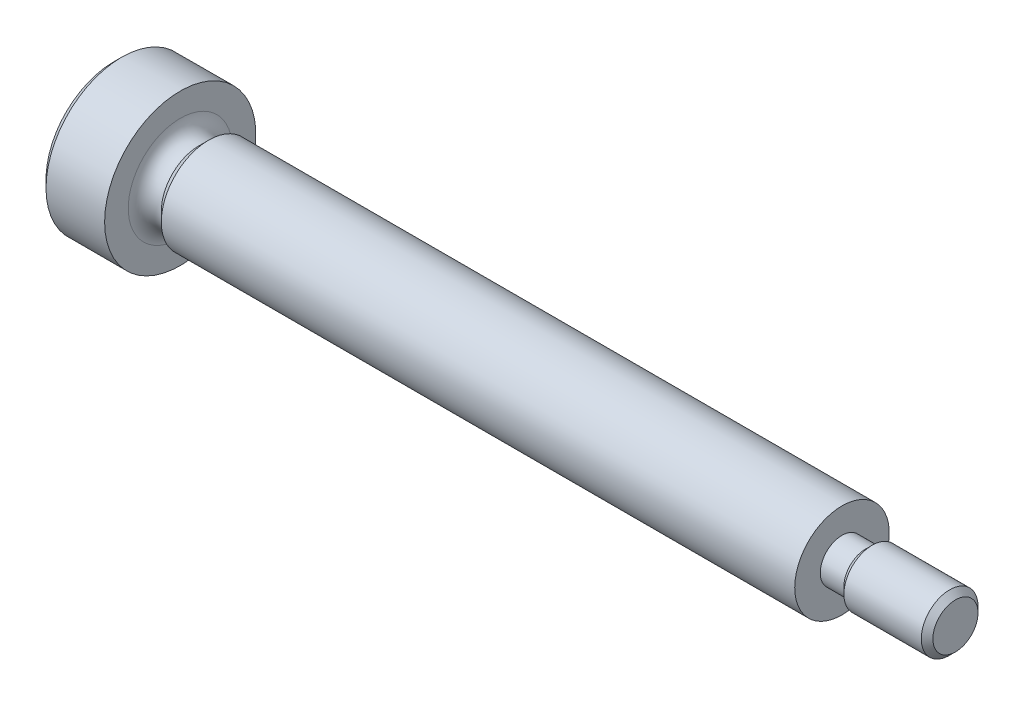
ISO-10303-21;
HEADER;
FILE_DESCRIPTION(('STEP AP214'),'2;1');
FILE_NAME('part.step','',(''),(''),'','','');
FILE_SCHEMA(('AUTOMOTIVE_DESIGN { 1 0 10303 214 1 1 1 1 }'));
ENDSEC;
DATA;
#1=APPLICATION_CONTEXT('core data for automotive mechanical design processes');
#2=APPLICATION_PROTOCOL_DEFINITION('international standard','automotive_design',2000,#1);
#3=PRODUCT_CONTEXT('',#1,'mechanical');
#4=PRODUCT('Part','Part','',(#3));
#5=PRODUCT_RELATED_PRODUCT_CATEGORY('part','',(#4));
#6=PRODUCT_DEFINITION_FORMATION('','',#4);
#7=PRODUCT_DEFINITION_CONTEXT('part definition',#1,'design');
#8=PRODUCT_DEFINITION('design','',#6,#7);
#9=PRODUCT_DEFINITION_SHAPE('','',#8);
#10=(LENGTH_UNIT() NAMED_UNIT(*) SI_UNIT(.MILLI.,.METRE.));
#11=(NAMED_UNIT(*) PLANE_ANGLE_UNIT() SI_UNIT($,.RADIAN.));
#12=(NAMED_UNIT(*) SI_UNIT($,.STERADIAN.) SOLID_ANGLE_UNIT());
#13=UNCERTAINTY_MEASURE_WITH_UNIT(LENGTH_MEASURE(1.E-05),#10,'distance_accuracy_value','');
#14=(GEOMETRIC_REPRESENTATION_CONTEXT(3) GLOBAL_UNCERTAINTY_ASSIGNED_CONTEXT((#13)) GLOBAL_UNIT_ASSIGNED_CONTEXT((#10,
#11,#12)) REPRESENTATION_CONTEXT('',''));
#15=CARTESIAN_POINT('',(0.,0.,0.));
#16=DIRECTION('',(0.,0.,1.));
#17=DIRECTION('',(1.,0.,0.));
#18=AXIS2_PLACEMENT_3D('',#15,#16,#17);
#19=CARTESIAN_POINT('',(-3.5,-3.60000000000003,3.60000027634451));
#20=DIRECTION('',(-1.,0.,0.));
#21=DIRECTION('',(0.,1.,0.));
#22=AXIS2_PLACEMENT_3D('',#19,#20,#21);
#23=PLANE('',#22);
#24=CARTESIAN_POINT('',(-3.5,0.,0.));
#25=DIRECTION('',(-1.,0.,0.));
#26=DIRECTION('',(0.,0.,-1.));
#27=AXIS2_PLACEMENT_3D('',#24,#25,#26);
#28=CIRCLE('',#27,3.6);
#29=CARTESIAN_POINT('',(-3.5,0.,-3.6));
#30=VERTEX_POINT('',#29);
#31=EDGE_CURVE('E111',#30,#30,#28,.F.);
#32=ORIENTED_EDGE('',*,*,#31,.F.);
#33=EDGE_LOOP('',(#32));
#34=FACE_BOUND('',#33,.T.);
#35=DIRECTION('',(0.,0.500000000000019,-0.866025403784427));
#36=VECTOR('',#35,1.);
#37=CARTESIAN_POINT('',(-3.5,-1.4433756729741,0.));
#38=LINE('',#37,#36);
#39=CARTESIAN_POINT('',(-3.5,-0.721687836487031,-1.25));
#40=VERTEX_POINT('',#39);
#41=CARTESIAN_POINT('',(-3.5,-1.4433756729741,0.));
#42=VERTEX_POINT('',#41);
#43=EDGE_CURVE('E98',#40,#42,#38,.F.);
#44=ORIENTED_EDGE('',*,*,#43,.F.);
#45=DIRECTION('',(0.,1.,0.));
#46=VECTOR('',#45,1.);
#47=CARTESIAN_POINT('',(-3.5,-0.72168783648703,-1.25));
#48=LINE('',#47,#46);
#49=CARTESIAN_POINT('',(-3.5,0.721687836487031,-1.25));
#50=VERTEX_POINT('',#49);
#51=EDGE_CURVE('E87',#50,#40,#48,.F.);
#52=ORIENTED_EDGE('',*,*,#51,.F.);
#53=DIRECTION('',(0.,0.500000000000019,0.866025403784427));
#54=VECTOR('',#53,1.);
#55=CARTESIAN_POINT('',(-3.5,0.721687836487028,-1.25));
#56=LINE('',#55,#54);
#57=CARTESIAN_POINT('',(-3.5,1.4433756729741,0.));
#58=VERTEX_POINT('',#57);
#59=EDGE_CURVE('E97',#58,#50,#56,.F.);
#60=ORIENTED_EDGE('',*,*,#59,.F.);
#61=DIRECTION('',(0.,-0.50000000000002,0.866025403784427));
#62=VECTOR('',#61,1.);
#63=CARTESIAN_POINT('',(-3.5,1.4433756729741,0.));
#64=LINE('',#63,#62);
#65=CARTESIAN_POINT('',(-3.5,0.721687836487028,1.25));
#66=VERTEX_POINT('',#65);
#67=EDGE_CURVE('E121',#66,#58,#64,.F.);
#68=ORIENTED_EDGE('',*,*,#67,.F.);
#69=DIRECTION('',(0.,-1.,0.));
#70=VECTOR('',#69,1.);
#71=CARTESIAN_POINT('',(-3.5,0.721687836487031,1.25));
#72=LINE('',#71,#70);
#73=CARTESIAN_POINT('',(-3.5,-0.72168783648703,1.25));
#74=VERTEX_POINT('',#73);
#75=EDGE_CURVE('E125',#74,#66,#72,.F.);
#76=ORIENTED_EDGE('',*,*,#75,.F.);
#77=DIRECTION('',(0.,-0.50000000000002,-0.866025403784427));
#78=VECTOR('',#77,1.);
#79=CARTESIAN_POINT('',(-3.5,-0.721687836487031,1.25));
#80=LINE('',#79,#78);
#81=EDGE_CURVE('E110',#42,#74,#80,.F.);
#82=ORIENTED_EDGE('',*,*,#81,.F.);
#83=EDGE_LOOP('',(#44,#52,#60,#68,#76,#82));
#84=FACE_BOUND('',#83,.T.);
#85=ADVANCED_FACE('F17',(#34,#84),#23,.T.);
#86=CARTESIAN_POINT('',(0.,-4.,-4.));
#87=DIRECTION('',(1.,0.,0.));
#88=DIRECTION('',(0.,1.,0.));
#89=AXIS2_PLACEMENT_3D('',#86,#87,#88);
#90=PLANE('',#89);
#91=CARTESIAN_POINT('',(0.,0.,0.));
#92=DIRECTION('',(1.,0.,0.));
#93=DIRECTION('',(0.,0.,1.));
#94=AXIS2_PLACEMENT_3D('',#91,#92,#93);
#95=CIRCLE('',#94,4.);
#96=CARTESIAN_POINT('',(0.,0.,4.));
#97=VERTEX_POINT('',#96);
#98=EDGE_CURVE('E133',#97,#97,#95,.T.);
#99=ORIENTED_EDGE('',*,*,#98,.T.);
#100=EDGE_LOOP('',(#99));
#101=FACE_BOUND('',#100,.T.);
#102=CARTESIAN_POINT('',(0.,0.,0.));
#103=DIRECTION('',(-1.,0.,0.));
#104=DIRECTION('',(0.,0.,-1.));
#105=AXIS2_PLACEMENT_3D('',#102,#103,#104);
#106=CIRCLE('',#105,2.75);
#107=CARTESIAN_POINT('',(0.,0.,-2.75));
#108=VERTEX_POINT('',#107);
#109=EDGE_CURVE('E138',#108,#108,#106,.F.);
#110=ORIENTED_EDGE('',*,*,#109,.F.);
#111=EDGE_LOOP('',(#110));
#112=FACE_BOUND('',#111,.T.);
#113=ADVANCED_FACE('F284',(#101,#112),#90,.T.);
#114=CARTESIAN_POINT('',(35.,-2.49999987914998,-2.5));
#115=DIRECTION('',(1.,0.,0.));
#116=DIRECTION('',(0.,1.,0.));
#117=AXIS2_PLACEMENT_3D('',#114,#115,#116);
#118=PLANE('',#117);
#119=CARTESIAN_POINT('',(35.,0.,0.));
#120=DIRECTION('',(1.,0.,0.));
#121=DIRECTION('',(0.,-1.41721898572201E-07,0.99999999999999));
#122=AXIS2_PLACEMENT_3D('',#119,#120,#121);
#123=CIRCLE('',#122,2.5);
#124=CARTESIAN_POINT('',(35.,-3.54304746430502E-07,2.49999999999997));
#125=VERTEX_POINT('',#124);
#126=EDGE_CURVE('E141',#125,#125,#123,.T.);
#127=ORIENTED_EDGE('',*,*,#126,.T.);
#128=EDGE_LOOP('',(#127));
#129=FACE_BOUND('',#128,.T.);
#130=CARTESIAN_POINT('',(35.,0.,0.));
#131=DIRECTION('',(-1.,0.,0.));
#132=DIRECTION('',(0.,0.,-1.));
#133=AXIS2_PLACEMENT_3D('',#130,#131,#132);
#134=CIRCLE('',#133,1.15);
#135=CARTESIAN_POINT('',(35.,0.,-1.15));
#136=VERTEX_POINT('',#135);
#137=EDGE_CURVE('E144',#136,#136,#134,.F.);
#138=ORIENTED_EDGE('',*,*,#137,.F.);
#139=EDGE_LOOP('',(#138));
#140=FACE_BOUND('',#139,.T.);
#141=ADVANCED_FACE('F281',(#129,#140),#118,.T.);
#142=CARTESIAN_POINT('',(41.,-1.20903473026753,-1.1935));
#143=DIRECTION('',(1.,0.,0.));
#144=DIRECTION('',(0.,1.,0.));
#145=AXIS2_PLACEMENT_3D('',#142,#143,#144);
#146=PLANE('',#145);
#147=CARTESIAN_POINT('',(41.,0.,0.));
#148=DIRECTION('',(1.,0.,0.));
#149=DIRECTION('',(0.,0.,1.));
#150=AXIS2_PLACEMENT_3D('',#147,#148,#149);
#151=CIRCLE('',#150,1.1935);
#152=CARTESIAN_POINT('',(41.,0.,1.1935));
#153=VERTEX_POINT('',#152);
#154=EDGE_CURVE('E147',#153,#153,#151,.T.);
#155=ORIENTED_EDGE('',*,*,#154,.T.);
#156=EDGE_LOOP('',(#155));
#157=FACE_BOUND('',#156,.T.);
#158=ADVANCED_FACE('F283',(#157),#146,.T.);
#159=CARTESIAN_POINT('',(-1.9,-1.08253175473054,-0.625000000000031));
#160=DIRECTION('',(-1.,0.,0.));
#161=DIRECTION('',(0.,1.,0.));
#162=AXIS2_PLACEMENT_3D('',#159,#160,#161);
#163=PLANE('',#162);
#164=DIRECTION('',(0.,-1.,0.));
#165=VECTOR('',#164,1.);
#166=CARTESIAN_POINT('',(-1.9,0.,-1.25));
#167=LINE('',#166,#165);
#168=CARTESIAN_POINT('',(-1.9,-0.72168783648703,-1.25));
#169=VERTEX_POINT('',#168);
#170=CARTESIAN_POINT('',(-1.9,0.,-1.25));
#171=VERTEX_POINT('',#170);
#172=EDGE_CURVE('E150',#169,#171,#167,.F.);
#173=ORIENTED_EDGE('',*,*,#172,.F.);
#174=DIRECTION('',(0.,-0.500000000000018,0.866025403784428));
#175=VECTOR('',#174,1.);
#176=CARTESIAN_POINT('',(-1.9,-0.721687836487029,-1.25));
#177=LINE('',#176,#175);
#178=CARTESIAN_POINT('',(-1.9,-1.08253175473054,-0.625000000000031));
#179=VERTEX_POINT('',#178);
#180=EDGE_CURVE('E105',#179,#169,#177,.F.);
#181=ORIENTED_EDGE('',*,*,#180,.F.);
#182=CARTESIAN_POINT('',(-1.9,0.,0.));
#183=DIRECTION('',(1.,0.,0.));
#184=DIRECTION('',(0.,-0.866025403784427,-0.50000000000002));
#185=AXIS2_PLACEMENT_3D('',#182,#183,#184);
#186=CIRCLE('',#185,1.25);
#187=EDGE_CURVE('E155',#179,#171,#186,.T.);
#188=ORIENTED_EDGE('',*,*,#187,.T.);
#189=EDGE_LOOP('',(#173,#181,#188));
#190=FACE_BOUND('',#189,.T.);
#191=ADVANCED_FACE('F292',(#190),#163,.T.);
#192=CARTESIAN_POINT('',(-1.9,-1.4433756729741,0.625000000000032));
#193=DIRECTION('',(-1.,0.,0.));
#194=DIRECTION('',(0.,1.,0.));
#195=AXIS2_PLACEMENT_3D('',#192,#193,#194);
#196=PLANE('',#195);
#197=DIRECTION('',(0.,-0.500000000000022,0.866025403784426));
#198=VECTOR('',#197,1.);
#199=CARTESIAN_POINT('',(-1.9,-1.08253175473054,-0.625000000000031));
#200=LINE('',#199,#198);
#201=CARTESIAN_POINT('',(-1.9,-1.4433756729741,0.));
#202=VERTEX_POINT('',#201);
#203=EDGE_CURVE('E160',#202,#179,#200,.F.);
#204=ORIENTED_EDGE('',*,*,#203,.F.);
#205=DIRECTION('',(0.,0.500000000000022,0.866025403784426));
#206=VECTOR('',#205,1.);
#207=CARTESIAN_POINT('',(-1.9,-1.4433756729741,0.));
#208=LINE('',#207,#206);
#209=CARTESIAN_POINT('',(-1.9,-1.08253175473054,0.625000000000031));
#210=VERTEX_POINT('',#209);
#211=EDGE_CURVE('E164',#210,#202,#208,.F.);
#212=ORIENTED_EDGE('',*,*,#211,.F.);
#213=CARTESIAN_POINT('',(-1.9,0.,0.));
#214=DIRECTION('',(1.,0.,0.));
#215=DIRECTION('',(0.,-0.866025403784427,0.50000000000002));
#216=AXIS2_PLACEMENT_3D('',#213,#214,#215);
#217=CIRCLE('',#216,1.25);
#218=EDGE_CURVE('E169',#210,#179,#217,.T.);
#219=ORIENTED_EDGE('',*,*,#218,.T.);
#220=EDGE_LOOP('',(#204,#212,#219));
#221=FACE_BOUND('',#220,.T.);
#222=ADVANCED_FACE('F355',(#221),#196,.T.);
#223=CARTESIAN_POINT('',(-1.9,-1.08253175473054,1.25));
#224=DIRECTION('',(-1.,0.,0.));
#225=DIRECTION('',(0.,1.,0.));
#226=AXIS2_PLACEMENT_3D('',#223,#224,#225);
#227=PLANE('',#226);
#228=DIRECTION('',(0.,0.500000000000017,0.866025403784429));
#229=VECTOR('',#228,1.);
#230=CARTESIAN_POINT('',(-1.9,-1.08253175473054,0.625000000000031));
#231=LINE('',#230,#229);
#232=CARTESIAN_POINT('',(-1.9,-0.72168783648703,1.25));
#233=VERTEX_POINT('',#232);
#234=EDGE_CURVE('E174',#233,#210,#231,.F.);
#235=ORIENTED_EDGE('',*,*,#234,.F.);
#236=DIRECTION('',(0.,1.,0.));
#237=VECTOR('',#236,1.);
#238=CARTESIAN_POINT('',(-1.9,-0.72168783648703,1.25));
#239=LINE('',#238,#237);
#240=CARTESIAN_POINT('',(-1.9,0.,1.25));
#241=VERTEX_POINT('',#240);
#242=EDGE_CURVE('E178',#241,#233,#239,.F.);
#243=ORIENTED_EDGE('',*,*,#242,.F.);
#244=CARTESIAN_POINT('',(-1.9,0.,0.));
#245=DIRECTION('',(1.,0.,0.));
#246=DIRECTION('',(0.,0.,1.));
#247=AXIS2_PLACEMENT_3D('',#244,#245,#246);
#248=CIRCLE('',#247,1.25);
#249=EDGE_CURVE('E183',#241,#210,#248,.T.);
#250=ORIENTED_EDGE('',*,*,#249,.T.);
#251=EDGE_LOOP('',(#235,#243,#250));
#252=FACE_BOUND('',#251,.T.);
#253=ADVANCED_FACE('F361',(#252),#227,.T.);
#254=CARTESIAN_POINT('',(-1.9,0.,1.25));
#255=DIRECTION('',(-1.,0.,0.));
#256=DIRECTION('',(0.,1.,0.));
#257=AXIS2_PLACEMENT_3D('',#254,#255,#256);
#258=PLANE('',#257);
#259=DIRECTION('',(0.,1.,0.));
#260=VECTOR('',#259,1.);
#261=CARTESIAN_POINT('',(-1.9,0.,1.25));
#262=LINE('',#261,#260);
#263=CARTESIAN_POINT('',(-1.9,0.72168783648703,1.25));
#264=VERTEX_POINT('',#263);
#265=EDGE_CURVE('E188',#264,#241,#262,.F.);
#266=ORIENTED_EDGE('',*,*,#265,.F.);
#267=DIRECTION('',(0.,0.500000000000018,-0.866025403784428));
#268=VECTOR('',#267,1.);
#269=CARTESIAN_POINT('',(-1.9,0.721687836487029,1.25));
#270=LINE('',#269,#268);
#271=CARTESIAN_POINT('',(-1.9,1.08253175473054,0.625000000000031));
#272=VERTEX_POINT('',#271);
#273=EDGE_CURVE('E192',#272,#264,#270,.F.);
#274=ORIENTED_EDGE('',*,*,#273,.F.);
#275=CARTESIAN_POINT('',(-1.9,0.,0.));
#276=DIRECTION('',(1.,0.,0.));
#277=DIRECTION('',(0.,0.866025403784427,0.50000000000002));
#278=AXIS2_PLACEMENT_3D('',#275,#276,#277);
#279=CIRCLE('',#278,1.25);
#280=EDGE_CURVE('E196',#272,#241,#279,.T.);
#281=ORIENTED_EDGE('',*,*,#280,.T.);
#282=EDGE_LOOP('',(#266,#274,#281));
#283=FACE_BOUND('',#282,.T.);
#284=ADVANCED_FACE('F368',(#283),#258,.T.);
#285=CARTESIAN_POINT('',(-1.9,1.08253175473053,0.625000000000032));
#286=DIRECTION('',(-1.,0.,0.));
#287=DIRECTION('',(0.,1.,0.));
#288=AXIS2_PLACEMENT_3D('',#285,#286,#287);
#289=PLANE('',#288);
#290=DIRECTION('',(0.,0.500000000000023,-0.866025403784426));
#291=VECTOR('',#290,1.);
#292=CARTESIAN_POINT('',(-1.9,1.08253175473054,0.625000000000031));
#293=LINE('',#292,#291);
#294=CARTESIAN_POINT('',(-1.9,1.4433756729741,0.));
#295=VERTEX_POINT('',#294);
#296=EDGE_CURVE('E201',#295,#272,#293,.F.);
#297=ORIENTED_EDGE('',*,*,#296,.F.);
#298=DIRECTION('',(0.,-0.500000000000022,-0.866025403784426));
#299=VECTOR('',#298,1.);
#300=CARTESIAN_POINT('',(-1.9,1.4433756729741,0.));
#301=LINE('',#300,#299);
#302=CARTESIAN_POINT('',(-1.9,1.08253175473054,-0.625000000000031));
#303=VERTEX_POINT('',#302);
#304=EDGE_CURVE('E205',#303,#295,#301,.F.);
#305=ORIENTED_EDGE('',*,*,#304,.F.);
#306=CARTESIAN_POINT('',(-1.9,0.,0.));
#307=DIRECTION('',(1.,0.,0.));
#308=DIRECTION('',(0.,0.866025403784427,-0.50000000000002));
#309=AXIS2_PLACEMENT_3D('',#306,#307,#308);
#310=CIRCLE('',#309,1.25);
#311=EDGE_CURVE('E210',#303,#272,#310,.T.);
#312=ORIENTED_EDGE('',*,*,#311,.T.);
#313=EDGE_LOOP('',(#297,#305,#312));
#314=FACE_BOUND('',#313,.T.);
#315=ADVANCED_FACE('F373',(#314),#289,.T.);
#316=CARTESIAN_POINT('',(-1.9,0.,-0.625000000000031));
#317=DIRECTION('',(-1.,0.,0.));
#318=DIRECTION('',(0.,1.,0.));
#319=AXIS2_PLACEMENT_3D('',#316,#317,#318);
#320=PLANE('',#319);
#321=DIRECTION('',(0.,-0.500000000000017,-0.866025403784429));
#322=VECTOR('',#321,1.);
#323=CARTESIAN_POINT('',(-1.9,1.08253175473054,-0.625000000000031));
#324=LINE('',#323,#322);
#325=CARTESIAN_POINT('',(-1.9,0.72168783648703,-1.25));
#326=VERTEX_POINT('',#325);
#327=EDGE_CURVE('E215',#326,#303,#324,.F.);
#328=ORIENTED_EDGE('',*,*,#327,.F.);
#329=DIRECTION('',(0.,-1.,0.));
#330=VECTOR('',#329,1.);
#331=CARTESIAN_POINT('',(-1.9,0.72168783648703,-1.25));
#332=LINE('',#331,#330);
#333=EDGE_CURVE('E219',#171,#326,#332,.F.);
#334=ORIENTED_EDGE('',*,*,#333,.F.);
#335=CARTESIAN_POINT('',(-1.9,0.,0.));
#336=DIRECTION('',(1.,0.,0.));
#337=DIRECTION('',(0.,0.,-1.));
#338=AXIS2_PLACEMENT_3D('',#335,#336,#337);
#339=CIRCLE('',#338,1.25);
#340=EDGE_CURVE('E223',#171,#303,#339,.T.);
#341=ORIENTED_EDGE('',*,*,#340,.T.);
#342=EDGE_LOOP('',(#328,#334,#341));
#343=FACE_BOUND('',#342,.T.);
#344=ADVANCED_FACE('F376',(#343),#320,.T.);
#345=CARTESIAN_POINT('',(-1.9,-0.72168783648703,1.25));
#346=DIRECTION('',(0.,0.,-1.));
#347=DIRECTION('',(-1.,0.,0.));
#348=AXIS2_PLACEMENT_3D('',#345,#346,#347);
#349=PLANE('',#348);
#350=ORIENTED_EDGE('',*,*,#265,.T.);
#351=ORIENTED_EDGE('',*,*,#242,.T.);
#352=DIRECTION('',(-1.,0.,0.));
#353=VECTOR('',#352,1.);
#354=CARTESIAN_POINT('',(-1.9,-0.72168783648703,1.25));
#355=LINE('',#354,#353);
#356=EDGE_CURVE('E228',#233,#74,#355,.T.);
#357=ORIENTED_EDGE('',*,*,#356,.T.);
#358=ORIENTED_EDGE('',*,*,#75,.T.);
#359=DIRECTION('',(1.,0.,0.));
#360=VECTOR('',#359,1.);
#361=CARTESIAN_POINT('',(-3.5,0.72168783648703,1.25));
#362=LINE('',#361,#360);
#363=EDGE_CURVE('E233',#264,#66,#362,.F.);
#364=ORIENTED_EDGE('',*,*,#363,.F.);
#365=EDGE_LOOP('',(#350,#351,#357,#358,#364));
#366=FACE_BOUND('',#365,.T.);
#367=ADVANCED_FACE('F363',(#366),#349,.T.);
#368=CARTESIAN_POINT('',(-3.5,-1.4433756729741,0.));
#369=DIRECTION('',(0.,0.866025403784427,-0.50000000000002));
#370=DIRECTION('',(0.,0.50000000000002,0.866025403784427));
#371=AXIS2_PLACEMENT_3D('',#368,#369,#370);
#372=PLANE('',#371);
#373=ORIENTED_EDGE('',*,*,#234,.T.);
#374=ORIENTED_EDGE('',*,*,#211,.T.);
#375=DIRECTION('',(-1.,0.,0.));
#376=VECTOR('',#375,1.);
#377=CARTESIAN_POINT('',(-1.9,-1.4433756729741,0.));
#378=LINE('',#377,#376);
#379=EDGE_CURVE('E106',#202,#42,#378,.T.);
#380=ORIENTED_EDGE('',*,*,#379,.T.);
#381=ORIENTED_EDGE('',*,*,#81,.T.);
#382=ORIENTED_EDGE('',*,*,#356,.F.);
#383=EDGE_LOOP('',(#373,#374,#380,#381,#382));
#384=FACE_BOUND('',#383,.T.);
#385=ADVANCED_FACE('F357',(#384),#372,.T.);
#386=CARTESIAN_POINT('',(-3.5,-0.72168783648703,-1.25));
#387=DIRECTION('',(0.,0.866025403784427,0.50000000000002));
#388=DIRECTION('',(0.,-0.50000000000002,0.866025403784427));
#389=AXIS2_PLACEMENT_3D('',#386,#387,#388);
#390=PLANE('',#389);
#391=ORIENTED_EDGE('',*,*,#203,.T.);
#392=ORIENTED_EDGE('',*,*,#180,.T.);
#393=DIRECTION('',(-1.,0.,0.));
#394=VECTOR('',#393,1.);
#395=CARTESIAN_POINT('',(-1.9,-0.72168783648703,-1.25));
#396=LINE('',#395,#394);
#397=EDGE_CURVE('E91',#169,#40,#396,.T.);
#398=ORIENTED_EDGE('',*,*,#397,.T.);
#399=ORIENTED_EDGE('',*,*,#43,.T.);
#400=ORIENTED_EDGE('',*,*,#379,.F.);
#401=EDGE_LOOP('',(#391,#392,#398,#399,#400));
#402=FACE_BOUND('',#401,.T.);
#403=ADVANCED_FACE('F102',(#402),#390,.T.);
#404=CARTESIAN_POINT('',(-3.5,-0.72168783648703,-1.25));
#405=DIRECTION('',(0.,0.,1.));
#406=DIRECTION('',(1.,0.,0.));
#407=AXIS2_PLACEMENT_3D('',#404,#405,#406);
#408=PLANE('',#407);
#409=ORIENTED_EDGE('',*,*,#172,.T.);
#410=ORIENTED_EDGE('',*,*,#333,.T.);
#411=DIRECTION('',(-1.,0.,0.));
#412=VECTOR('',#411,1.);
#413=CARTESIAN_POINT('',(-1.9,0.72168783648703,-1.25));
#414=LINE('',#413,#412);
#415=EDGE_CURVE('E35',#326,#50,#414,.T.);
#416=ORIENTED_EDGE('',*,*,#415,.T.);
#417=ORIENTED_EDGE('',*,*,#51,.T.);
#418=ORIENTED_EDGE('',*,*,#397,.F.);
#419=EDGE_LOOP('',(#409,#410,#416,#417,#418));
#420=FACE_BOUND('',#419,.T.);
#421=ADVANCED_FACE('F90',(#420),#408,.T.);
#422=CARTESIAN_POINT('',(-3.5,1.4433756729741,0.));
#423=DIRECTION('',(0.,-0.866025403784427,0.50000000000002));
#424=DIRECTION('',(0.,-0.50000000000002,-0.866025403784427));
#425=AXIS2_PLACEMENT_3D('',#422,#423,#424);
#426=PLANE('',#425);
#427=ORIENTED_EDGE('',*,*,#327,.T.);
#428=ORIENTED_EDGE('',*,*,#304,.T.);
#429=DIRECTION('',(-1.,0.,0.));
#430=VECTOR('',#429,1.);
#431=CARTESIAN_POINT('',(-1.9,1.4433756729741,0.));
#432=LINE('',#431,#430);
#433=EDGE_CURVE('E245',#295,#58,#432,.T.);
#434=ORIENTED_EDGE('',*,*,#433,.T.);
#435=ORIENTED_EDGE('',*,*,#59,.T.);
#436=ORIENTED_EDGE('',*,*,#415,.F.);
#437=EDGE_LOOP('',(#427,#428,#434,#435,#436));
#438=FACE_BOUND('',#437,.T.);
#439=ADVANCED_FACE('F317',(#438),#426,.T.);
#440=CARTESIAN_POINT('',(-3.5,0.72168783648703,1.25));
#441=DIRECTION('',(0.,-0.866025403784427,-0.50000000000002));
#442=DIRECTION('',(0.,0.50000000000002,-0.866025403784427));
#443=AXIS2_PLACEMENT_3D('',#440,#441,#442);
#444=PLANE('',#443);
#445=ORIENTED_EDGE('',*,*,#296,.T.);
#446=ORIENTED_EDGE('',*,*,#273,.T.);
#447=ORIENTED_EDGE('',*,*,#363,.T.);
#448=ORIENTED_EDGE('',*,*,#67,.T.);
#449=ORIENTED_EDGE('',*,*,#433,.F.);
#450=EDGE_LOOP('',(#445,#446,#447,#448,#449));
#451=FACE_BOUND('',#450,.T.);
#452=ADVANCED_FACE('F307',(#451),#444,.T.);
#453=CARTESIAN_POINT('',(-3.1,0.,0.));
#454=DIRECTION('',(1.,0.,0.));
#455=DIRECTION('',(0.,1.42036770911853E-07,0.99999999999999));
#456=AXIS2_PLACEMENT_3D('',#453,#454,#455);
#457=CONICAL_SURFACE('',#456,4.,0.785398163397442);
#458=CARTESIAN_POINT('',(-3.1,0.,0.));
#459=DIRECTION('',(-1.,0.,0.));
#460=DIRECTION('',(0.,0.,-1.));
#461=AXIS2_PLACEMENT_3D('',#458,#459,#460);
#462=CIRCLE('',#461,4.);
#463=CARTESIAN_POINT('',(-3.1,0.,-4.));
#464=VERTEX_POINT('',#463);
#465=EDGE_CURVE('E250',#464,#464,#462,.F.);
#466=ORIENTED_EDGE('',*,*,#465,.F.);
#467=EDGE_LOOP('',(#466));
#468=FACE_BOUND('',#467,.T.);
#469=ORIENTED_EDGE('',*,*,#31,.T.);
#470=EDGE_LOOP('',(#469));
#471=FACE_BOUND('',#470,.T.);
#472=ADVANCED_FACE('F304',(#468,#471),#457,.T.);
#473=CARTESIAN_POINT('',(41.,0.,0.));
#474=DIRECTION('',(1.,0.,0.));
#475=DIRECTION('',(0.,7.69313624256337E-10,1.));
#476=AXIS2_PLACEMENT_3D('',#473,#474,#475);
#477=CYLINDRICAL_SURFACE('',#476,4.);
#478=ORIENTED_EDGE('',*,*,#98,.F.);
#479=EDGE_LOOP('',(#478));
#480=FACE_BOUND('',#479,.T.);
#481=ORIENTED_EDGE('',*,*,#465,.T.);
#482=EDGE_LOOP('',(#481));
#483=FACE_BOUND('',#482,.T.);
#484=ADVANCED_FACE('F306',(#480,#483),#477,.T.);
#485=CARTESIAN_POINT('',(0.815694337319579,0.,0.));
#486=DIRECTION('',(1.,0.,0.));
#487=DIRECTION('',(0.,0.,1.));
#488=AXIS2_PLACEMENT_3D('',#485,#486,#487);
#489=TOROIDAL_SURFACE('',#488,2.79617085730968,0.816999999999962);
#490=CARTESIAN_POINT('',(0.999,0.,0.));
#491=DIRECTION('',(-1.,0.,0.));
#492=DIRECTION('',(0.,0.,-1.));
#493=AXIS2_PLACEMENT_3D('',#490,#491,#492);
#494=CIRCLE('',#493,2.);
#495=CARTESIAN_POINT('',(0.999,0.,-2.));
#496=VERTEX_POINT('',#495);
#497=EDGE_CURVE('E255',#496,#496,#494,.F.);
#498=ORIENTED_EDGE('',*,*,#497,.F.);
#499=EDGE_LOOP('',(#498));
#500=FACE_BOUND('',#499,.T.);
#501=ORIENTED_EDGE('',*,*,#109,.T.);
#502=EDGE_LOOP('',(#501));
#503=FACE_BOUND('',#502,.T.);
#504=ADVANCED_FACE('F314',(#500,#503),#489,.F.);
#505=CARTESIAN_POINT('',(1.499,0.,0.));
#506=DIRECTION('',(1.,0.,0.));
#507=DIRECTION('',(0.,1.92343152856519E-10,1.));
#508=AXIS2_PLACEMENT_3D('',#505,#506,#507);
#509=CONICAL_SURFACE('',#508,2.5,0.785398163397448);
#510=CARTESIAN_POINT('',(1.499,0.,0.));
#511=DIRECTION('',(-1.,0.,0.));
#512=DIRECTION('',(0.,0.,-1.));
#513=AXIS2_PLACEMENT_3D('',#510,#511,#512);
#514=CIRCLE('',#513,2.5);
#515=CARTESIAN_POINT('',(1.499,0.,-2.5));
#516=VERTEX_POINT('',#515);
#517=EDGE_CURVE('E258',#516,#516,#514,.F.);
#518=ORIENTED_EDGE('',*,*,#517,.F.);
#519=EDGE_LOOP('',(#518));
#520=FACE_BOUND('',#519,.T.);
#521=ORIENTED_EDGE('',*,*,#497,.T.);
#522=EDGE_LOOP('',(#521));
#523=FACE_BOUND('',#522,.T.);
#524=ADVANCED_FACE('F325',(#520,#523),#509,.T.);
#525=CARTESIAN_POINT('',(41.,0.,0.));
#526=DIRECTION('',(1.,0.,0.));
#527=DIRECTION('',(0.,7.69370911764408E-10,1.));
#528=AXIS2_PLACEMENT_3D('',#525,#526,#527);
#529=CYLINDRICAL_SURFACE('',#528,2.5);
#530=ORIENTED_EDGE('',*,*,#126,.F.);
#531=EDGE_LOOP('',(#530));
#532=FACE_BOUND('',#531,.T.);
#533=ORIENTED_EDGE('',*,*,#517,.T.);
#534=EDGE_LOOP('',(#533));
#535=FACE_BOUND('',#534,.T.);
#536=ADVANCED_FACE('F277',(#532,#535),#529,.T.);
#537=CARTESIAN_POINT('',(41.,0.,0.));
#538=DIRECTION('',(1.,0.,0.));
#539=DIRECTION('',(0.,0.,1.));
#540=AXIS2_PLACEMENT_3D('',#537,#538,#539);
#541=CYLINDRICAL_SURFACE('',#540,1.15);
#542=CARTESIAN_POINT('',(36.25,0.,0.));
#543=DIRECTION('',(-1.,0.,0.));
#544=DIRECTION('',(0.,0.,-1.));
#545=AXIS2_PLACEMENT_3D('',#542,#543,#544);
#546=CIRCLE('',#545,1.15);
#547=CARTESIAN_POINT('',(36.25,0.,-1.15));
#548=VERTEX_POINT('',#547);
#549=EDGE_CURVE('E261',#548,#548,#546,.F.);
#550=ORIENTED_EDGE('',*,*,#549,.F.);
#551=EDGE_LOOP('',(#550));
#552=FACE_BOUND('',#551,.T.);
#553=ORIENTED_EDGE('',*,*,#137,.T.);
#554=EDGE_LOOP('',(#553));
#555=FACE_BOUND('',#554,.T.);
#556=ADVANCED_FACE('F271',(#552,#555),#541,.T.);
#557=CARTESIAN_POINT('',(36.6,0.,0.));
#558=DIRECTION('',(1.,0.,0.));
#559=DIRECTION('',(0.,1.92332494715483E-10,1.));
#560=AXIS2_PLACEMENT_3D('',#557,#558,#559);
#561=CONICAL_SURFACE('',#560,1.5,0.785398163397443);
#562=CARTESIAN_POINT('',(36.6,0.,0.));
#563=DIRECTION('',(-1.,0.,0.));
#564=DIRECTION('',(0.,0.,-1.));
#565=AXIS2_PLACEMENT_3D('',#562,#563,#564);
#566=CIRCLE('',#565,1.5);
#567=CARTESIAN_POINT('',(36.6,0.,-1.5));
#568=VERTEX_POINT('',#567);
#569=EDGE_CURVE('E25',#568,#568,#566,.F.);
#570=ORIENTED_EDGE('',*,*,#569,.F.);
#571=EDGE_LOOP('',(#570));
#572=FACE_BOUND('',#571,.T.);
#573=ORIENTED_EDGE('',*,*,#549,.T.);
#574=EDGE_LOOP('',(#573));
#575=FACE_BOUND('',#574,.T.);
#576=ADVANCED_FACE('F268',(#572,#575),#561,.T.);
#577=CARTESIAN_POINT('',(41.,0.,0.));
#578=DIRECTION('',(1.,0.,0.));
#579=DIRECTION('',(0.,7.69328723289472E-10,1.));
#580=AXIS2_PLACEMENT_3D('',#577,#578,#579);
#581=CYLINDRICAL_SURFACE('',#580,1.5);
#582=CARTESIAN_POINT('',(40.6935,0.,0.));
#583=DIRECTION('',(-1.,0.,0.));
#584=DIRECTION('',(0.,0.,-1.));
#585=AXIS2_PLACEMENT_3D('',#582,#583,#584);
#586=CIRCLE('',#585,1.5);
#587=CARTESIAN_POINT('',(40.6935,0.,-1.5));
#588=VERTEX_POINT('',#587);
#589=EDGE_CURVE('E11',#588,#588,#586,.F.);
#590=ORIENTED_EDGE('',*,*,#589,.F.);
#591=EDGE_LOOP('',(#590));
#592=FACE_BOUND('',#591,.T.);
#593=ORIENTED_EDGE('',*,*,#569,.T.);
#594=EDGE_LOOP('',(#593));
#595=FACE_BOUND('',#594,.T.);
#596=ADVANCED_FACE('F266',(#592,#595),#581,.T.);
#597=CARTESIAN_POINT('',(40.6935,0.,0.));
#598=DIRECTION('',(-1.,0.,0.));
#599=DIRECTION('',(0.,0.,-1.));
#600=AXIS2_PLACEMENT_3D('',#597,#598,#599);
#601=CONICAL_SURFACE('',#600,1.5,0.785398163397446);
#602=ORIENTED_EDGE('',*,*,#154,.F.);
#603=EDGE_LOOP('',(#602));
#604=FACE_BOUND('',#603,.T.);
#605=ORIENTED_EDGE('',*,*,#589,.T.);
#606=EDGE_LOOP('',(#605));
#607=FACE_BOUND('',#606,.T.);
#608=ADVANCED_FACE('F334',(#604,#607),#601,.T.);
#609=CARTESIAN_POINT('',(-1.9,0.,0.));
#610=DIRECTION('',(-1.,0.,0.));
#611=DIRECTION('',(0.,0.,-1.));
#612=AXIS2_PLACEMENT_3D('',#609,#610,#611);
#613=CONICAL_SURFACE('',#612,1.25000000000001,1.04719755119662);
#614=ORIENTED_EDGE('',*,*,#187,.F.);
#615=ORIENTED_EDGE('',*,*,#218,.F.);
#616=ORIENTED_EDGE('',*,*,#249,.F.);
#617=ORIENTED_EDGE('',*,*,#280,.F.);
#618=ORIENTED_EDGE('',*,*,#311,.F.);
#619=ORIENTED_EDGE('',*,*,#340,.F.);
#620=EDGE_LOOP('',(#614,#615,#616,#617,#618,#619));
#621=FACE_BOUND('',#620,.T.);
#622=CARTESIAN_POINT('',(-1.178312163513,0.,0.));
#623=VERTEX_POINT('',#622);
#624=VERTEX_LOOP('',#623);
#625=FACE_BOUND('',#624,.T.);
#626=ADVANCED_FACE('F19',(#621,#625),#613,.F.);
#627=CLOSED_SHELL('',(#85,#113,#141,#158,#191,#222,#253,#284,#315,#344,#367,#385,#403,#421,#439,
#452,#472,#484,#504,#524,#536,#556,#576,#596,#608,#626));
#628=MANIFOLD_SOLID_BREP('B1',#627);
#629=ADVANCED_BREP_SHAPE_REPRESENTATION('',(#18,#628),#14);
#630=SHAPE_DEFINITION_REPRESENTATION(#9,#629);
ENDSEC;
END-ISO-10303-21;
